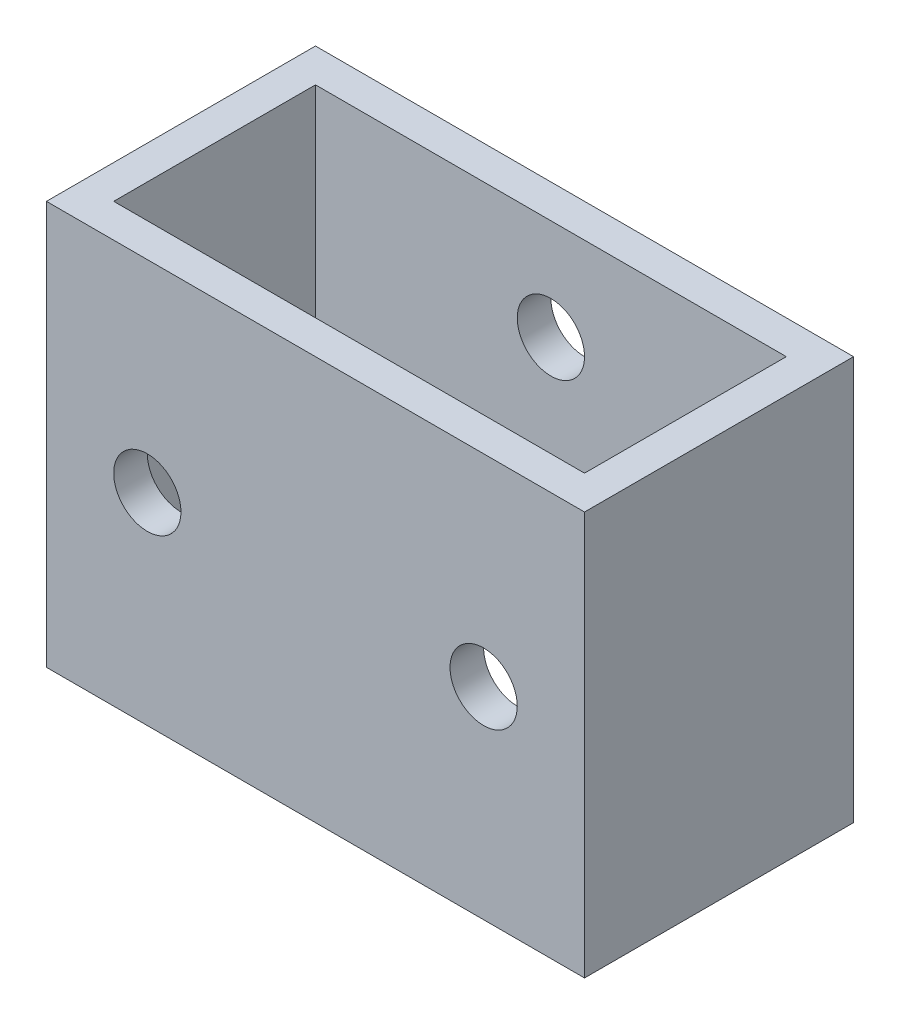
ISO-10303-21;
HEADER;
FILE_DESCRIPTION(('STEP AP214'),'2;1');
FILE_NAME('part.step','',(''),(''),'','','');
FILE_SCHEMA(('AUTOMOTIVE_DESIGN { 1 0 10303 214 1 1 1 1 }'));
ENDSEC;
DATA;
#1=APPLICATION_CONTEXT('core data for automotive mechanical design processes');
#2=APPLICATION_PROTOCOL_DEFINITION('international standard','automotive_design',2000,#1);
#3=PRODUCT_CONTEXT('',#1,'mechanical');
#4=PRODUCT('Part','Part','',(#3));
#5=PRODUCT_RELATED_PRODUCT_CATEGORY('part','',(#4));
#6=PRODUCT_DEFINITION_FORMATION('','',#4);
#7=PRODUCT_DEFINITION_CONTEXT('part definition',#1,'design');
#8=PRODUCT_DEFINITION('design','',#6,#7);
#9=PRODUCT_DEFINITION_SHAPE('','',#8);
#10=(LENGTH_UNIT() NAMED_UNIT(*) SI_UNIT(.MILLI.,.METRE.));
#11=(NAMED_UNIT(*) PLANE_ANGLE_UNIT() SI_UNIT($,.RADIAN.));
#12=(NAMED_UNIT(*) SI_UNIT($,.STERADIAN.) SOLID_ANGLE_UNIT());
#13=UNCERTAINTY_MEASURE_WITH_UNIT(LENGTH_MEASURE(1.E-05),#10,'distance_accuracy_value','');
#14=(GEOMETRIC_REPRESENTATION_CONTEXT(3) GLOBAL_UNCERTAINTY_ASSIGNED_CONTEXT((#13)) GLOBAL_UNIT_ASSIGNED_CONTEXT((#10,
#11,#12)) REPRESENTATION_CONTEXT('',''));
#15=CARTESIAN_POINT('',(0.,0.,0.));
#16=DIRECTION('',(0.,0.,1.));
#17=DIRECTION('',(1.,0.,0.));
#18=AXIS2_PLACEMENT_3D('',#15,#16,#17);
#19=CARTESIAN_POINT('',(0.,38.1,0.));
#20=DIRECTION('',(0.,1.,0.));
#21=DIRECTION('',(0.,0.,1.));
#22=AXIS2_PLACEMENT_3D('',#19,#20,#21);
#23=PLANE('',#22);
#24=DIRECTION('',(0.,0.,-1.));
#25=VECTOR('',#24,1.);
#26=CARTESIAN_POINT('',(25.4,38.1,-12.7));
#27=LINE('',#26,#25);
#28=CARTESIAN_POINT('',(25.4,38.1,12.7));
#29=VERTEX_POINT('',#28);
#30=CARTESIAN_POINT('',(25.4,38.1,-12.7));
#31=VERTEX_POINT('',#30);
#32=EDGE_CURVE('E136',#29,#31,#27,.T.);
#33=ORIENTED_EDGE('',*,*,#32,.T.);
#34=DIRECTION('',(-1.,0.,0.));
#35=VECTOR('',#34,1.);
#36=CARTESIAN_POINT('',(-25.4,38.1,-12.7));
#37=LINE('',#36,#35);
#38=CARTESIAN_POINT('',(-25.4,38.1,-12.7));
#39=VERTEX_POINT('',#38);
#40=EDGE_CURVE('E139',#31,#39,#37,.T.);
#41=ORIENTED_EDGE('',*,*,#40,.T.);
#42=DIRECTION('',(0.,0.,1.));
#43=VECTOR('',#42,1.);
#44=CARTESIAN_POINT('',(-25.4,38.1,-12.7));
#45=LINE('',#44,#43);
#46=CARTESIAN_POINT('',(-25.4,38.1,12.7));
#47=VERTEX_POINT('',#46);
#48=EDGE_CURVE('E142',#39,#47,#45,.T.);
#49=ORIENTED_EDGE('',*,*,#48,.T.);
#50=DIRECTION('',(1.,0.,0.));
#51=VECTOR('',#50,1.);
#52=CARTESIAN_POINT('',(-25.4,38.1,12.7));
#53=LINE('',#52,#51);
#54=EDGE_CURVE('E144',#47,#29,#53,.T.);
#55=ORIENTED_EDGE('',*,*,#54,.T.);
#56=EDGE_LOOP('',(#33,#41,#49,#55));
#57=FACE_BOUND('',#56,.T.);
#58=DIRECTION('',(1.,0.,0.));
#59=VECTOR('',#58,1.);
#60=CARTESIAN_POINT('',(22.225,38.1,9.52499999999999));
#61=LINE('',#60,#59);
#62=CARTESIAN_POINT('',(-22.225,38.1,9.525));
#63=VERTEX_POINT('',#62);
#64=CARTESIAN_POINT('',(22.225,38.1,9.52499999999999));
#65=VERTEX_POINT('',#64);
#66=EDGE_CURVE('E106',#63,#65,#61,.T.);
#67=ORIENTED_EDGE('',*,*,#66,.F.);
#68=DIRECTION('',(0.,0.,1.));
#69=VECTOR('',#68,1.);
#70=CARTESIAN_POINT('',(-22.225,38.1,-9.525));
#71=LINE('',#70,#69);
#72=CARTESIAN_POINT('',(-22.225,38.1,-9.525));
#73=VERTEX_POINT('',#72);
#74=EDGE_CURVE('E98',#73,#63,#71,.T.);
#75=ORIENTED_EDGE('',*,*,#74,.F.);
#76=DIRECTION('',(-1.,0.,0.));
#77=VECTOR('',#76,1.);
#78=CARTESIAN_POINT('',(22.225,38.1,-9.52500000000001));
#79=LINE('',#78,#77);
#80=CARTESIAN_POINT('',(22.225,38.1,-9.52500000000001));
#81=VERTEX_POINT('',#80);
#82=EDGE_CURVE('E120',#81,#73,#79,.T.);
#83=ORIENTED_EDGE('',*,*,#82,.F.);
#84=DIRECTION('',(0.,0.,-1.));
#85=VECTOR('',#84,1.);
#86=CARTESIAN_POINT('',(22.225,38.1,-9.52500000000001));
#87=LINE('',#86,#85);
#88=EDGE_CURVE('E118',#65,#81,#87,.T.);
#89=ORIENTED_EDGE('',*,*,#88,.F.);
#90=EDGE_LOOP('',(#67,#75,#83,#89));
#91=FACE_BOUND('',#90,.T.);
#92=ADVANCED_FACE('F33',(#57,#91),#23,.T.);
#93=CARTESIAN_POINT('',(0.,0.,0.));
#94=DIRECTION('',(0.,1.,0.));
#95=DIRECTION('',(0.,0.,1.));
#96=AXIS2_PLACEMENT_3D('',#93,#94,#95);
#97=PLANE('',#96);
#98=DIRECTION('',(0.,0.,-1.));
#99=VECTOR('',#98,1.);
#100=CARTESIAN_POINT('',(25.4,0.,-12.7));
#101=LINE('',#100,#99);
#102=CARTESIAN_POINT('',(25.4,0.,12.7));
#103=VERTEX_POINT('',#102);
#104=CARTESIAN_POINT('',(25.4,0.,-12.7));
#105=VERTEX_POINT('',#104);
#106=EDGE_CURVE('E114',#103,#105,#101,.T.);
#107=ORIENTED_EDGE('',*,*,#106,.F.);
#108=DIRECTION('',(1.,0.,0.));
#109=VECTOR('',#108,1.);
#110=CARTESIAN_POINT('',(-25.4,0.,12.7));
#111=LINE('',#110,#109);
#112=CARTESIAN_POINT('',(-25.4,0.,12.7));
#113=VERTEX_POINT('',#112);
#114=EDGE_CURVE('E140',#113,#103,#111,.T.);
#115=ORIENTED_EDGE('',*,*,#114,.F.);
#116=DIRECTION('',(0.,0.,1.));
#117=VECTOR('',#116,1.);
#118=CARTESIAN_POINT('',(-25.4,0.,-12.7));
#119=LINE('',#118,#117);
#120=CARTESIAN_POINT('',(-25.4,0.,-12.7));
#121=VERTEX_POINT('',#120);
#122=EDGE_CURVE('E151',#121,#113,#119,.T.);
#123=ORIENTED_EDGE('',*,*,#122,.F.);
#124=DIRECTION('',(-1.,0.,0.));
#125=VECTOR('',#124,1.);
#126=CARTESIAN_POINT('',(-25.4,0.,-12.7));
#127=LINE('',#126,#125);
#128=EDGE_CURVE('E149',#105,#121,#127,.T.);
#129=ORIENTED_EDGE('',*,*,#128,.F.);
#130=EDGE_LOOP('',(#107,#115,#123,#129));
#131=FACE_BOUND('',#130,.T.);
#132=DIRECTION('',(0.,0.,1.));
#133=VECTOR('',#132,1.);
#134=CARTESIAN_POINT('',(-22.225,0.,-9.525));
#135=LINE('',#134,#133);
#136=CARTESIAN_POINT('',(-22.225,0.,-9.525));
#137=VERTEX_POINT('',#136);
#138=CARTESIAN_POINT('',(-22.225,0.,9.525));
#139=VERTEX_POINT('',#138);
#140=EDGE_CURVE('E56',#137,#139,#135,.T.);
#141=ORIENTED_EDGE('',*,*,#140,.T.);
#142=DIRECTION('',(1.,0.,0.));
#143=VECTOR('',#142,1.);
#144=CARTESIAN_POINT('',(22.225,0.,9.52499999999999));
#145=LINE('',#144,#143);
#146=CARTESIAN_POINT('',(22.225,0.,9.52499999999999));
#147=VERTEX_POINT('',#146);
#148=EDGE_CURVE('E113',#139,#147,#145,.T.);
#149=ORIENTED_EDGE('',*,*,#148,.T.);
#150=DIRECTION('',(0.,0.,-1.));
#151=VECTOR('',#150,1.);
#152=CARTESIAN_POINT('',(22.225,0.,-9.52500000000001));
#153=LINE('',#152,#151);
#154=CARTESIAN_POINT('',(22.225,0.,-9.52500000000001));
#155=VERTEX_POINT('',#154);
#156=EDGE_CURVE('E128',#147,#155,#153,.T.);
#157=ORIENTED_EDGE('',*,*,#156,.T.);
#158=DIRECTION('',(-1.,0.,0.));
#159=VECTOR('',#158,1.);
#160=CARTESIAN_POINT('',(22.225,0.,-9.52500000000001));
#161=LINE('',#160,#159);
#162=EDGE_CURVE('E107',#155,#137,#161,.T.);
#163=ORIENTED_EDGE('',*,*,#162,.T.);
#164=EDGE_LOOP('',(#141,#149,#157,#163));
#165=FACE_BOUND('',#164,.T.);
#166=ADVANCED_FACE('F169',(#131,#165),#97,.F.);
#167=CARTESIAN_POINT('',(25.4,38.1,-12.7));
#168=DIRECTION('',(-1.,0.,0.));
#169=DIRECTION('',(0.,0.,1.));
#170=AXIS2_PLACEMENT_3D('',#167,#168,#169);
#171=PLANE('',#170);
#172=ORIENTED_EDGE('',*,*,#106,.T.);
#173=DIRECTION('',(0.,-1.,0.));
#174=VECTOR('',#173,1.);
#175=CARTESIAN_POINT('',(25.4,38.1,-12.7));
#176=LINE('',#175,#174);
#177=EDGE_CURVE('E11',#31,#105,#176,.T.);
#178=ORIENTED_EDGE('',*,*,#177,.F.);
#179=ORIENTED_EDGE('',*,*,#32,.F.);
#180=DIRECTION('',(0.,-1.,0.));
#181=VECTOR('',#180,1.);
#182=CARTESIAN_POINT('',(25.4,38.1,12.7));
#183=LINE('',#182,#181);
#184=EDGE_CURVE('E146',#29,#103,#183,.T.);
#185=ORIENTED_EDGE('',*,*,#184,.T.);
#186=EDGE_LOOP('',(#172,#178,#179,#185));
#187=FACE_BOUND('',#186,.T.);
#188=ADVANCED_FACE('F35',(#187),#171,.F.);
#189=CARTESIAN_POINT('',(-25.4,38.1,-12.7));
#190=DIRECTION('',(0.,0.,1.));
#191=DIRECTION('',(1.,0.,0.));
#192=AXIS2_PLACEMENT_3D('',#189,#190,#191);
#193=PLANE('',#192);
#194=CARTESIAN_POINT('',(0.,9.525,-12.7));
#195=DIRECTION('',(0.,0.,-1.));
#196=DIRECTION('',(-1.,0.,0.));
#197=AXIS2_PLACEMENT_3D('',#194,#195,#196);
#198=CIRCLE('',#197,3.175);
#199=CARTESIAN_POINT('',(-3.175,9.525,-12.7));
#200=VERTEX_POINT('',#199);
#201=EDGE_CURVE('E215',#200,#200,#198,.T.);
#202=ORIENTED_EDGE('',*,*,#201,.F.);
#203=EDGE_LOOP('',(#202));
#204=FACE_BOUND('',#203,.T.);
#205=CARTESIAN_POINT('',(0.,28.575,-12.7));
#206=DIRECTION('',(0.,0.,-1.));
#207=DIRECTION('',(-1.,0.,0.));
#208=AXIS2_PLACEMENT_3D('',#205,#206,#207);
#209=CIRCLE('',#208,3.175);
#210=CARTESIAN_POINT('',(-3.175,28.575,-12.7));
#211=VERTEX_POINT('',#210);
#212=EDGE_CURVE('E126',#211,#211,#209,.T.);
#213=ORIENTED_EDGE('',*,*,#212,.F.);
#214=EDGE_LOOP('',(#213));
#215=FACE_BOUND('',#214,.T.);
#216=ORIENTED_EDGE('',*,*,#128,.T.);
#217=DIRECTION('',(0.,-1.,0.));
#218=VECTOR('',#217,1.);
#219=CARTESIAN_POINT('',(-25.4,38.1,-12.7));
#220=LINE('',#219,#218);
#221=EDGE_CURVE('E41',#39,#121,#220,.T.);
#222=ORIENTED_EDGE('',*,*,#221,.F.);
#223=ORIENTED_EDGE('',*,*,#40,.F.);
#224=ORIENTED_EDGE('',*,*,#177,.T.);
#225=EDGE_LOOP('',(#216,#222,#223,#224));
#226=FACE_BOUND('',#225,.T.);
#227=ADVANCED_FACE('F179',(#204,#215,#226),#193,.F.);
#228=CARTESIAN_POINT('',(-25.4,38.1,-12.7));
#229=DIRECTION('',(1.,0.,0.));
#230=DIRECTION('',(0.,0.,-1.));
#231=AXIS2_PLACEMENT_3D('',#228,#229,#230);
#232=PLANE('',#231);
#233=ORIENTED_EDGE('',*,*,#122,.T.);
#234=DIRECTION('',(0.,-1.,0.));
#235=VECTOR('',#234,1.);
#236=CARTESIAN_POINT('',(-25.4,38.1,12.7));
#237=LINE('',#236,#235);
#238=EDGE_CURVE('E156',#47,#113,#237,.T.);
#239=ORIENTED_EDGE('',*,*,#238,.F.);
#240=ORIENTED_EDGE('',*,*,#48,.F.);
#241=ORIENTED_EDGE('',*,*,#221,.T.);
#242=EDGE_LOOP('',(#233,#239,#240,#241));
#243=FACE_BOUND('',#242,.T.);
#244=ADVANCED_FACE('F163',(#243),#232,.F.);
#245=CARTESIAN_POINT('',(-25.4,38.1,12.7));
#246=DIRECTION('',(0.,0.,-1.));
#247=DIRECTION('',(-1.,0.,0.));
#248=AXIS2_PLACEMENT_3D('',#245,#246,#247);
#249=PLANE('',#248);
#250=CARTESIAN_POINT('',(-15.875,19.05,12.7));
#251=DIRECTION('',(0.,0.,1.));
#252=DIRECTION('',(1.,0.,0.));
#253=AXIS2_PLACEMENT_3D('',#250,#251,#252);
#254=CIRCLE('',#253,3.175);
#255=CARTESIAN_POINT('',(-12.7,19.05,12.7));
#256=VERTEX_POINT('',#255);
#257=EDGE_CURVE('E206',#256,#256,#254,.T.);
#258=ORIENTED_EDGE('',*,*,#257,.F.);
#259=EDGE_LOOP('',(#258));
#260=FACE_BOUND('',#259,.T.);
#261=CARTESIAN_POINT('',(15.875,19.05,12.7));
#262=DIRECTION('',(0.,0.,1.));
#263=DIRECTION('',(1.,0.,0.));
#264=AXIS2_PLACEMENT_3D('',#261,#262,#263);
#265=CIRCLE('',#264,3.175);
#266=CARTESIAN_POINT('',(19.05,19.05,12.7));
#267=VERTEX_POINT('',#266);
#268=EDGE_CURVE('E209',#267,#267,#265,.T.);
#269=ORIENTED_EDGE('',*,*,#268,.F.);
#270=EDGE_LOOP('',(#269));
#271=FACE_BOUND('',#270,.T.);
#272=ORIENTED_EDGE('',*,*,#114,.T.);
#273=ORIENTED_EDGE('',*,*,#184,.F.);
#274=ORIENTED_EDGE('',*,*,#54,.F.);
#275=ORIENTED_EDGE('',*,*,#238,.T.);
#276=EDGE_LOOP('',(#272,#273,#274,#275));
#277=FACE_BOUND('',#276,.T.);
#278=ADVANCED_FACE('F173',(#260,#271,#277),#249,.F.);
#279=CARTESIAN_POINT('',(-22.225,38.1,-9.525));
#280=DIRECTION('',(1.,0.,0.));
#281=DIRECTION('',(0.,0.,-1.));
#282=AXIS2_PLACEMENT_3D('',#279,#280,#281);
#283=PLANE('',#282);
#284=ORIENTED_EDGE('',*,*,#140,.F.);
#285=DIRECTION('',(0.,-1.,0.));
#286=VECTOR('',#285,1.);
#287=CARTESIAN_POINT('',(-22.225,38.1,-9.525));
#288=LINE('',#287,#286);
#289=EDGE_CURVE('E102',#73,#137,#288,.T.);
#290=ORIENTED_EDGE('',*,*,#289,.F.);
#291=ORIENTED_EDGE('',*,*,#74,.T.);
#292=DIRECTION('',(0.,-1.,0.));
#293=VECTOR('',#292,1.);
#294=CARTESIAN_POINT('',(-22.225,38.1,9.525));
#295=LINE('',#294,#293);
#296=EDGE_CURVE('E101',#63,#139,#295,.T.);
#297=ORIENTED_EDGE('',*,*,#296,.T.);
#298=EDGE_LOOP('',(#284,#290,#291,#297));
#299=FACE_BOUND('',#298,.T.);
#300=ADVANCED_FACE('F100',(#299),#283,.T.);
#301=CARTESIAN_POINT('',(22.225,38.1,9.52499999999999));
#302=DIRECTION('',(0.,0.,-1.));
#303=DIRECTION('',(-1.,0.,0.));
#304=AXIS2_PLACEMENT_3D('',#301,#302,#303);
#305=PLANE('',#304);
#306=CARTESIAN_POINT('',(-15.875,19.05,9.525));
#307=DIRECTION('',(0.,0.,-1.));
#308=DIRECTION('',(-1.,0.,0.));
#309=AXIS2_PLACEMENT_3D('',#306,#307,#308);
#310=CIRCLE('',#309,3.175);
#311=CARTESIAN_POINT('',(-12.7,19.05,9.525));
#312=VERTEX_POINT('',#311);
#313=EDGE_CURVE('E257',#312,#312,#310,.F.);
#314=ORIENTED_EDGE('',*,*,#313,.T.);
#315=EDGE_LOOP('',(#314));
#316=FACE_BOUND('',#315,.T.);
#317=CARTESIAN_POINT('',(15.875,19.05,9.52499999999999));
#318=DIRECTION('',(0.,0.,-1.));
#319=DIRECTION('',(-1.,0.,0.));
#320=AXIS2_PLACEMENT_3D('',#317,#318,#319);
#321=CIRCLE('',#320,3.175);
#322=CARTESIAN_POINT('',(19.05,19.05,9.52499999999999));
#323=VERTEX_POINT('',#322);
#324=EDGE_CURVE('E212',#323,#323,#321,.F.);
#325=ORIENTED_EDGE('',*,*,#324,.T.);
#326=EDGE_LOOP('',(#325));
#327=FACE_BOUND('',#326,.T.);
#328=ORIENTED_EDGE('',*,*,#148,.F.);
#329=ORIENTED_EDGE('',*,*,#296,.F.);
#330=ORIENTED_EDGE('',*,*,#66,.T.);
#331=DIRECTION('',(0.,-1.,0.));
#332=VECTOR('',#331,1.);
#333=CARTESIAN_POINT('',(22.225,38.1,9.52499999999999));
#334=LINE('',#333,#332);
#335=EDGE_CURVE('E115',#65,#147,#334,.T.);
#336=ORIENTED_EDGE('',*,*,#335,.T.);
#337=EDGE_LOOP('',(#328,#329,#330,#336));
#338=FACE_BOUND('',#337,.T.);
#339=ADVANCED_FACE('F110',(#316,#327,#338),#305,.T.);
#340=CARTESIAN_POINT('',(22.225,38.1,-9.52500000000001));
#341=DIRECTION('',(-1.,0.,0.));
#342=DIRECTION('',(0.,0.,1.));
#343=AXIS2_PLACEMENT_3D('',#340,#341,#342);
#344=PLANE('',#343);
#345=ORIENTED_EDGE('',*,*,#156,.F.);
#346=ORIENTED_EDGE('',*,*,#335,.F.);
#347=ORIENTED_EDGE('',*,*,#88,.T.);
#348=DIRECTION('',(0.,-1.,0.));
#349=VECTOR('',#348,1.);
#350=CARTESIAN_POINT('',(22.225,38.1,-9.52500000000001));
#351=LINE('',#350,#349);
#352=EDGE_CURVE('E48',#81,#155,#351,.T.);
#353=ORIENTED_EDGE('',*,*,#352,.T.);
#354=EDGE_LOOP('',(#345,#346,#347,#353));
#355=FACE_BOUND('',#354,.T.);
#356=ADVANCED_FACE('F243',(#355),#344,.T.);
#357=CARTESIAN_POINT('',(22.225,38.1,-9.52500000000001));
#358=DIRECTION('',(0.,0.,1.));
#359=DIRECTION('',(1.,0.,0.));
#360=AXIS2_PLACEMENT_3D('',#357,#358,#359);
#361=PLANE('',#360);
#362=CARTESIAN_POINT('',(0.,9.525,-9.525));
#363=DIRECTION('',(0.,0.,1.));
#364=DIRECTION('',(1.,0.,0.));
#365=AXIS2_PLACEMENT_3D('',#362,#363,#364);
#366=CIRCLE('',#365,3.175);
#367=CARTESIAN_POINT('',(-3.175,9.525,-9.525));
#368=VERTEX_POINT('',#367);
#369=EDGE_CURVE('E211',#368,#368,#366,.F.);
#370=ORIENTED_EDGE('',*,*,#369,.T.);
#371=EDGE_LOOP('',(#370));
#372=FACE_BOUND('',#371,.T.);
#373=CARTESIAN_POINT('',(0.,28.575,-9.525));
#374=DIRECTION('',(0.,0.,1.));
#375=DIRECTION('',(1.,0.,0.));
#376=AXIS2_PLACEMENT_3D('',#373,#374,#375);
#377=CIRCLE('',#376,3.175);
#378=CARTESIAN_POINT('',(-3.175,28.575,-9.525));
#379=VERTEX_POINT('',#378);
#380=EDGE_CURVE('E222',#379,#379,#377,.F.);
#381=ORIENTED_EDGE('',*,*,#380,.T.);
#382=EDGE_LOOP('',(#381));
#383=FACE_BOUND('',#382,.T.);
#384=ORIENTED_EDGE('',*,*,#162,.F.);
#385=ORIENTED_EDGE('',*,*,#352,.F.);
#386=ORIENTED_EDGE('',*,*,#82,.T.);
#387=ORIENTED_EDGE('',*,*,#289,.T.);
#388=EDGE_LOOP('',(#384,#385,#386,#387));
#389=FACE_BOUND('',#388,.T.);
#390=ADVANCED_FACE('F228',(#372,#383,#389),#361,.T.);
#391=CARTESIAN_POINT('',(0.,28.575,12.701));
#392=DIRECTION('',(0.,0.,-1.));
#393=DIRECTION('',(-1.,0.,0.));
#394=AXIS2_PLACEMENT_3D('',#391,#392,#393);
#395=CYLINDRICAL_SURFACE('',#394,3.175);
#396=CARTESIAN_POINT('',(-3.175,28.575,-9.525));
#397=CARTESIAN_POINT('',(-3.175,28.575,-9.55807291666666));
#398=CARTESIAN_POINT('',(-3.175,28.575,-9.59114583333333));
#399=CARTESIAN_POINT('',(-3.175,28.575,-9.65729166666666));
#400=CARTESIAN_POINT('',(-3.175,28.575,-9.69036458333333));
#401=CARTESIAN_POINT('',(-3.175,28.575,-9.75651041666666));
#402=CARTESIAN_POINT('',(-3.175,28.575,-9.78958333333333));
#403=CARTESIAN_POINT('',(-3.175,28.575,-9.85572916666666));
#404=CARTESIAN_POINT('',(-3.175,28.575,-9.88880208333333));
#405=CARTESIAN_POINT('',(-3.175,28.575,-9.95494791666666));
#406=CARTESIAN_POINT('',(-3.175,28.575,-9.98802083333333));
#407=CARTESIAN_POINT('',(-3.175,28.575,-10.0541666666667));
#408=CARTESIAN_POINT('',(-3.175,28.575,-10.0872395833333));
#409=CARTESIAN_POINT('',(-3.175,28.575,-10.1533854166667));
#410=CARTESIAN_POINT('',(-3.175,28.575,-10.1864583333333));
#411=CARTESIAN_POINT('',(-3.175,28.575,-10.2526041666667));
#412=CARTESIAN_POINT('',(-3.175,28.575,-10.2856770833333));
#413=CARTESIAN_POINT('',(-3.175,28.575,-10.3518229166667));
#414=CARTESIAN_POINT('',(-3.175,28.575,-10.3848958333333));
#415=CARTESIAN_POINT('',(-3.175,28.575,-10.4510416666667));
#416=CARTESIAN_POINT('',(-3.175,28.575,-10.4841145833333));
#417=CARTESIAN_POINT('',(-3.175,28.575,-10.5502604166667));
#418=CARTESIAN_POINT('',(-3.175,28.575,-10.5833333333333));
#419=CARTESIAN_POINT('',(-3.175,28.575,-10.6494791666667));
#420=CARTESIAN_POINT('',(-3.175,28.575,-10.6825520833333));
#421=CARTESIAN_POINT('',(-3.175,28.575,-10.7486979166667));
#422=CARTESIAN_POINT('',(-3.175,28.575,-10.7817708333333));
#423=CARTESIAN_POINT('',(-3.175,28.575,-10.8479166666667));
#424=CARTESIAN_POINT('',(-3.175,28.575,-10.8809895833333));
#425=CARTESIAN_POINT('',(-3.175,28.575,-10.9471354166667));
#426=CARTESIAN_POINT('',(-3.175,28.575,-10.9802083333333));
#427=CARTESIAN_POINT('',(-3.175,28.575,-11.0463541666667));
#428=CARTESIAN_POINT('',(-3.175,28.575,-11.0794270833333));
#429=CARTESIAN_POINT('',(-3.175,28.575,-11.1455729166667));
#430=CARTESIAN_POINT('',(-3.175,28.575,-11.1786458333333));
#431=CARTESIAN_POINT('',(-3.175,28.575,-11.2447916666667));
#432=CARTESIAN_POINT('',(-3.175,28.575,-11.2778645833333));
#433=CARTESIAN_POINT('',(-3.175,28.575,-11.3440104166667));
#434=CARTESIAN_POINT('',(-3.175,28.575,-11.3770833333333));
#435=CARTESIAN_POINT('',(-3.175,28.575,-11.4432291666667));
#436=CARTESIAN_POINT('',(-3.175,28.575,-11.4763020833333));
#437=CARTESIAN_POINT('',(-3.175,28.575,-11.5424479166667));
#438=CARTESIAN_POINT('',(-3.175,28.575,-11.5755208333333));
#439=CARTESIAN_POINT('',(-3.175,28.575,-11.6416666666667));
#440=CARTESIAN_POINT('',(-3.175,28.575,-11.6747395833333));
#441=CARTESIAN_POINT('',(-3.175,28.575,-11.7408854166667));
#442=CARTESIAN_POINT('',(-3.175,28.575,-11.7739583333333));
#443=CARTESIAN_POINT('',(-3.175,28.575,-11.8401041666667));
#444=CARTESIAN_POINT('',(-3.175,28.575,-11.8731770833333));
#445=CARTESIAN_POINT('',(-3.175,28.575,-11.9393229166667));
#446=CARTESIAN_POINT('',(-3.175,28.575,-11.9723958333333));
#447=CARTESIAN_POINT('',(-3.175,28.575,-12.0385416666667));
#448=CARTESIAN_POINT('',(-3.175,28.575,-12.0716145833333));
#449=CARTESIAN_POINT('',(-3.175,28.575,-12.1377604166667));
#450=CARTESIAN_POINT('',(-3.175,28.575,-12.1708333333333));
#451=CARTESIAN_POINT('',(-3.175,28.575,-12.2369791666667));
#452=CARTESIAN_POINT('',(-3.175,28.575,-12.2700520833333));
#453=CARTESIAN_POINT('',(-3.175,28.575,-12.3361979166667));
#454=CARTESIAN_POINT('',(-3.175,28.575,-12.3692708333333));
#455=CARTESIAN_POINT('',(-3.175,28.575,-12.4354166666667));
#456=CARTESIAN_POINT('',(-3.175,28.575,-12.4684895833333));
#457=CARTESIAN_POINT('',(-3.175,28.575,-12.5346354166667));
#458=CARTESIAN_POINT('',(-3.175,28.575,-12.5677083333333));
#459=CARTESIAN_POINT('',(-3.175,28.575,-12.6338541666667));
#460=CARTESIAN_POINT('',(-3.175,28.575,-12.6669270833333));
#461=CARTESIAN_POINT('',(-3.175,28.575,-12.7));
#462=B_SPLINE_CURVE_WITH_KNOTS('',3,(#396,#397,#398,#399,#400,#401,#402,#403,#404,#405,#406,
#407,#408,#409,#410,#411,#412,#413,#414,#415,#416,#417,#418,#419,#420,#421,#422,#423,#424,#425,
#426,#427,#428,#429,#430,#431,#432,#433,#434,#435,#436,#437,#438,#439,#440,#441,#442,#443,#444,
#445,#446,#447,#448,#449,#450,#451,#452,#453,#454,#455,#456,#457,#458,#459,#460,#461),
.UNSPECIFIED.,.F.,.F.,(4,2,2,2,2,2,2,2,2,2,2,2,2,2,2,2,2,2,2,2,2,2,2,2,2,2,2,2,2,2,2,2,4),(0.,
0.0992187500000012,0.198437499999999,0.29765625,0.396875000000001,0.496093749999999,0.5953125,
0.694531250000002,0.793750000000003,0.892968750000001,0.992187500000002,1.09140625,1.190625,
1.28984375,1.3890625,1.48828125,1.5875,1.68671875,1.7859375,1.88515625,1.984375,2.08359375,
2.1828125,2.28203125,2.38125,2.48046875,2.5796875,2.67890625,2.778125,2.87734375,
2.97656250000001,3.07578125,3.175),.UNSPECIFIED.);
#463=EDGE_CURVE('BSEAM230',#379,#211,#462,.T.);
#464=ORIENTED_EDGE('',*,*,#380,.F.);
#465=ORIENTED_EDGE('',*,*,#212,.T.);
#466=ORIENTED_EDGE('',*,*,#463,.T.);
#467=ORIENTED_EDGE('',*,*,#463,.F.);
#468=EDGE_LOOP('',(#464,#466,#465,#467));
#469=FACE_BOUND('',#468,.T.);
#470=ADVANCED_FACE('F230',(#469),#395,.F.);
#471=CARTESIAN_POINT('',(0.,9.525,12.701));
#472=DIRECTION('',(0.,0.,-1.));
#473=DIRECTION('',(-1.,0.,0.));
#474=AXIS2_PLACEMENT_3D('',#471,#472,#473);
#475=CYLINDRICAL_SURFACE('',#474,3.175);
#476=CARTESIAN_POINT('',(-3.175,9.525,-9.525));
#477=CARTESIAN_POINT('',(-3.175,9.525,-9.55807291666666));
#478=CARTESIAN_POINT('',(-3.175,9.525,-9.59114583333333));
#479=CARTESIAN_POINT('',(-3.175,9.525,-9.65729166666666));
#480=CARTESIAN_POINT('',(-3.175,9.525,-9.69036458333333));
#481=CARTESIAN_POINT('',(-3.175,9.525,-9.75651041666666));
#482=CARTESIAN_POINT('',(-3.175,9.525,-9.78958333333333));
#483=CARTESIAN_POINT('',(-3.175,9.525,-9.85572916666666));
#484=CARTESIAN_POINT('',(-3.175,9.525,-9.88880208333333));
#485=CARTESIAN_POINT('',(-3.175,9.525,-9.95494791666666));
#486=CARTESIAN_POINT('',(-3.175,9.525,-9.98802083333333));
#487=CARTESIAN_POINT('',(-3.175,9.525,-10.0541666666667));
#488=CARTESIAN_POINT('',(-3.175,9.525,-10.0872395833333));
#489=CARTESIAN_POINT('',(-3.175,9.525,-10.1533854166667));
#490=CARTESIAN_POINT('',(-3.175,9.525,-10.1864583333333));
#491=CARTESIAN_POINT('',(-3.175,9.525,-10.2526041666667));
#492=CARTESIAN_POINT('',(-3.175,9.525,-10.2856770833333));
#493=CARTESIAN_POINT('',(-3.175,9.525,-10.3518229166667));
#494=CARTESIAN_POINT('',(-3.175,9.525,-10.3848958333333));
#495=CARTESIAN_POINT('',(-3.175,9.525,-10.4510416666667));
#496=CARTESIAN_POINT('',(-3.175,9.525,-10.4841145833333));
#497=CARTESIAN_POINT('',(-3.175,9.525,-10.5502604166667));
#498=CARTESIAN_POINT('',(-3.175,9.525,-10.5833333333333));
#499=CARTESIAN_POINT('',(-3.175,9.525,-10.6494791666667));
#500=CARTESIAN_POINT('',(-3.175,9.525,-10.6825520833333));
#501=CARTESIAN_POINT('',(-3.175,9.525,-10.7486979166667));
#502=CARTESIAN_POINT('',(-3.175,9.525,-10.7817708333333));
#503=CARTESIAN_POINT('',(-3.175,9.525,-10.8479166666667));
#504=CARTESIAN_POINT('',(-3.175,9.525,-10.8809895833333));
#505=CARTESIAN_POINT('',(-3.175,9.525,-10.9471354166667));
#506=CARTESIAN_POINT('',(-3.175,9.525,-10.9802083333333));
#507=CARTESIAN_POINT('',(-3.175,9.525,-11.0463541666667));
#508=CARTESIAN_POINT('',(-3.175,9.525,-11.0794270833333));
#509=CARTESIAN_POINT('',(-3.175,9.525,-11.1455729166667));
#510=CARTESIAN_POINT('',(-3.175,9.525,-11.1786458333333));
#511=CARTESIAN_POINT('',(-3.175,9.525,-11.2447916666667));
#512=CARTESIAN_POINT('',(-3.175,9.525,-11.2778645833333));
#513=CARTESIAN_POINT('',(-3.175,9.525,-11.3440104166667));
#514=CARTESIAN_POINT('',(-3.175,9.525,-11.3770833333333));
#515=CARTESIAN_POINT('',(-3.175,9.525,-11.4432291666667));
#516=CARTESIAN_POINT('',(-3.175,9.525,-11.4763020833333));
#517=CARTESIAN_POINT('',(-3.175,9.525,-11.5424479166667));
#518=CARTESIAN_POINT('',(-3.175,9.525,-11.5755208333333));
#519=CARTESIAN_POINT('',(-3.175,9.525,-11.6416666666667));
#520=CARTESIAN_POINT('',(-3.175,9.525,-11.6747395833333));
#521=CARTESIAN_POINT('',(-3.175,9.525,-11.7408854166667));
#522=CARTESIAN_POINT('',(-3.175,9.525,-11.7739583333333));
#523=CARTESIAN_POINT('',(-3.175,9.525,-11.8401041666667));
#524=CARTESIAN_POINT('',(-3.175,9.525,-11.8731770833333));
#525=CARTESIAN_POINT('',(-3.175,9.525,-11.9393229166667));
#526=CARTESIAN_POINT('',(-3.175,9.525,-11.9723958333333));
#527=CARTESIAN_POINT('',(-3.175,9.525,-12.0385416666667));
#528=CARTESIAN_POINT('',(-3.175,9.525,-12.0716145833333));
#529=CARTESIAN_POINT('',(-3.175,9.525,-12.1377604166667));
#530=CARTESIAN_POINT('',(-3.175,9.525,-12.1708333333333));
#531=CARTESIAN_POINT('',(-3.175,9.525,-12.2369791666667));
#532=CARTESIAN_POINT('',(-3.175,9.525,-12.2700520833333));
#533=CARTESIAN_POINT('',(-3.175,9.525,-12.3361979166667));
#534=CARTESIAN_POINT('',(-3.175,9.525,-12.3692708333333));
#535=CARTESIAN_POINT('',(-3.175,9.525,-12.4354166666667));
#536=CARTESIAN_POINT('',(-3.175,9.525,-12.4684895833333));
#537=CARTESIAN_POINT('',(-3.175,9.525,-12.5346354166667));
#538=CARTESIAN_POINT('',(-3.175,9.525,-12.5677083333333));
#539=CARTESIAN_POINT('',(-3.175,9.525,-12.6338541666667));
#540=CARTESIAN_POINT('',(-3.175,9.525,-12.6669270833333));
#541=CARTESIAN_POINT('',(-3.175,9.525,-12.7));
#542=B_SPLINE_CURVE_WITH_KNOTS('',3,(#476,#477,#478,#479,#480,#481,#482,#483,#484,#485,#486,
#487,#488,#489,#490,#491,#492,#493,#494,#495,#496,#497,#498,#499,#500,#501,#502,#503,#504,#505,
#506,#507,#508,#509,#510,#511,#512,#513,#514,#515,#516,#517,#518,#519,#520,#521,#522,#523,#524,
#525,#526,#527,#528,#529,#530,#531,#532,#533,#534,#535,#536,#537,#538,#539,#540,#541),
.UNSPECIFIED.,.F.,.F.,(4,2,2,2,2,2,2,2,2,2,2,2,2,2,2,2,2,2,2,2,2,2,2,2,2,2,2,2,2,2,2,2,4),(0.,
0.0992187500000012,0.198437499999999,0.29765625,0.396875000000001,0.496093749999999,0.5953125,
0.694531250000002,0.793750000000003,0.892968750000001,0.992187500000002,1.09140625,1.190625,
1.28984375,1.3890625,1.48828125,1.5875,1.68671875,1.7859375,1.88515625,1.984375,2.08359375,
2.1828125,2.28203125,2.38125,2.48046875,2.5796875,2.67890625,2.778125,2.87734375,
2.97656250000001,3.07578125,3.175),.UNSPECIFIED.);
#543=EDGE_CURVE('BSEAM233',#368,#200,#542,.T.);
#544=ORIENTED_EDGE('',*,*,#369,.F.);
#545=ORIENTED_EDGE('',*,*,#201,.T.);
#546=ORIENTED_EDGE('',*,*,#543,.T.);
#547=ORIENTED_EDGE('',*,*,#543,.F.);
#548=EDGE_LOOP('',(#544,#546,#545,#547));
#549=FACE_BOUND('',#548,.T.);
#550=ADVANCED_FACE('F233',(#549),#475,.F.);
#551=CARTESIAN_POINT('',(15.875,19.05,-12.701));
#552=DIRECTION('',(0.,0.,1.));
#553=DIRECTION('',(1.,0.,0.));
#554=AXIS2_PLACEMENT_3D('',#551,#552,#553);
#555=CYLINDRICAL_SURFACE('',#554,3.175);
#556=CARTESIAN_POINT('',(19.05,19.05,9.52499999999999));
#557=CARTESIAN_POINT('',(19.05,19.05,9.55807291666665));
#558=CARTESIAN_POINT('',(19.05,19.05,9.59114583333332));
#559=CARTESIAN_POINT('',(19.05,19.05,9.65729166666666));
#560=CARTESIAN_POINT('',(19.05,19.05,9.69036458333332));
#561=CARTESIAN_POINT('',(19.05,19.05,9.75651041666665));
#562=CARTESIAN_POINT('',(19.05,19.05,9.78958333333332));
#563=CARTESIAN_POINT('',(19.05,19.05,9.85572916666666));
#564=CARTESIAN_POINT('',(19.05,19.05,9.88880208333332));
#565=CARTESIAN_POINT('',(19.05,19.05,9.95494791666666));
#566=CARTESIAN_POINT('',(19.05,19.05,9.98802083333332));
#567=CARTESIAN_POINT('',(19.05,19.05,10.0541666666667));
#568=CARTESIAN_POINT('',(19.05,19.05,10.0872395833333));
#569=CARTESIAN_POINT('',(19.05,19.05,10.1533854166667));
#570=CARTESIAN_POINT('',(19.05,19.05,10.1864583333333));
#571=CARTESIAN_POINT('',(19.05,19.05,10.2526041666667));
#572=CARTESIAN_POINT('',(19.05,19.05,10.2856770833333));
#573=CARTESIAN_POINT('',(19.05,19.05,10.3518229166667));
#574=CARTESIAN_POINT('',(19.05,19.05,10.3848958333333));
#575=CARTESIAN_POINT('',(19.05,19.05,10.4510416666667));
#576=CARTESIAN_POINT('',(19.05,19.05,10.4841145833333));
#577=CARTESIAN_POINT('',(19.05,19.05,10.5502604166667));
#578=CARTESIAN_POINT('',(19.05,19.05,10.5833333333333));
#579=CARTESIAN_POINT('',(19.05,19.05,10.6494791666667));
#580=CARTESIAN_POINT('',(19.05,19.05,10.6825520833333));
#581=CARTESIAN_POINT('',(19.05,19.05,10.7486979166667));
#582=CARTESIAN_POINT('',(19.05,19.05,10.7817708333333));
#583=CARTESIAN_POINT('',(19.05,19.05,10.8479166666667));
#584=CARTESIAN_POINT('',(19.05,19.05,10.8809895833333));
#585=CARTESIAN_POINT('',(19.05,19.05,10.9471354166667));
#586=CARTESIAN_POINT('',(19.05,19.05,10.9802083333333));
#587=CARTESIAN_POINT('',(19.05,19.05,11.0463541666667));
#588=CARTESIAN_POINT('',(19.05,19.05,11.0794270833333));
#589=CARTESIAN_POINT('',(19.05,19.05,11.1455729166667));
#590=CARTESIAN_POINT('',(19.05,19.05,11.1786458333333));
#591=CARTESIAN_POINT('',(19.05,19.05,11.2447916666667));
#592=CARTESIAN_POINT('',(19.05,19.05,11.2778645833333));
#593=CARTESIAN_POINT('',(19.05,19.05,11.3440104166667));
#594=CARTESIAN_POINT('',(19.05,19.05,11.3770833333333));
#595=CARTESIAN_POINT('',(19.05,19.05,11.4432291666667));
#596=CARTESIAN_POINT('',(19.05,19.05,11.4763020833333));
#597=CARTESIAN_POINT('',(19.05,19.05,11.5424479166667));
#598=CARTESIAN_POINT('',(19.05,19.05,11.5755208333333));
#599=CARTESIAN_POINT('',(19.05,19.05,11.6416666666667));
#600=CARTESIAN_POINT('',(19.05,19.05,11.6747395833333));
#601=CARTESIAN_POINT('',(19.05,19.05,11.7408854166667));
#602=CARTESIAN_POINT('',(19.05,19.05,11.7739583333333));
#603=CARTESIAN_POINT('',(19.05,19.05,11.8401041666667));
#604=CARTESIAN_POINT('',(19.05,19.05,11.8731770833333));
#605=CARTESIAN_POINT('',(19.05,19.05,11.9393229166667));
#606=CARTESIAN_POINT('',(19.05,19.05,11.9723958333333));
#607=CARTESIAN_POINT('',(19.05,19.05,12.0385416666667));
#608=CARTESIAN_POINT('',(19.05,19.05,12.0716145833333));
#609=CARTESIAN_POINT('',(19.05,19.05,12.1377604166667));
#610=CARTESIAN_POINT('',(19.05,19.05,12.1708333333333));
#611=CARTESIAN_POINT('',(19.05,19.05,12.2369791666667));
#612=CARTESIAN_POINT('',(19.05,19.05,12.2700520833333));
#613=CARTESIAN_POINT('',(19.05,19.05,12.3361979166667));
#614=CARTESIAN_POINT('',(19.05,19.05,12.3692708333333));
#615=CARTESIAN_POINT('',(19.05,19.05,12.4354166666667));
#616=CARTESIAN_POINT('',(19.05,19.05,12.4684895833333));
#617=CARTESIAN_POINT('',(19.05,19.05,12.5346354166667));
#618=CARTESIAN_POINT('',(19.05,19.05,12.5677083333333));
#619=CARTESIAN_POINT('',(19.05,19.05,12.6338541666667));
#620=CARTESIAN_POINT('',(19.05,19.05,12.6669270833333));
#621=CARTESIAN_POINT('',(19.05,19.05,12.7));
#622=B_SPLINE_CURVE_WITH_KNOTS('',3,(#556,#557,#558,#559,#560,#561,#562,#563,#564,#565,#566,
#567,#568,#569,#570,#571,#572,#573,#574,#575,#576,#577,#578,#579,#580,#581,#582,#583,#584,#585,
#586,#587,#588,#589,#590,#591,#592,#593,#594,#595,#596,#597,#598,#599,#600,#601,#602,#603,#604,
#605,#606,#607,#608,#609,#610,#611,#612,#613,#614,#615,#616,#617,#618,#619,#620,#621),
.UNSPECIFIED.,.F.,.F.,(4,2,2,2,2,2,2,2,2,2,2,2,2,2,2,2,2,2,2,2,2,2,2,2,2,2,2,2,2,2,2,2,4),(0.,
0.0992187500000012,0.198437499999999,0.29765625,0.396875000000001,0.496093749999999,0.5953125,
0.694531250000002,0.793750000000003,0.892968750000001,0.992187500000002,1.09140625,1.190625,
1.28984375,1.3890625,1.48828125,1.5875,1.68671875,1.7859375,1.88515625,1.984375,2.08359375,
2.1828125,2.28203125,2.38125,2.48046875,2.5796875,2.67890625,2.778125,2.87734375,
2.97656250000001,3.07578125,3.175),.UNSPECIFIED.);
#623=EDGE_CURVE('BSEAM240',#323,#267,#622,.T.);
#624=ORIENTED_EDGE('',*,*,#324,.F.);
#625=ORIENTED_EDGE('',*,*,#268,.T.);
#626=ORIENTED_EDGE('',*,*,#623,.T.);
#627=ORIENTED_EDGE('',*,*,#623,.F.);
#628=EDGE_LOOP('',(#624,#626,#625,#627));
#629=FACE_BOUND('',#628,.T.);
#630=ADVANCED_FACE('F240',(#629),#555,.F.);
#631=CARTESIAN_POINT('',(-15.875,19.05,-12.701));
#632=DIRECTION('',(0.,0.,1.));
#633=DIRECTION('',(1.,0.,0.));
#634=AXIS2_PLACEMENT_3D('',#631,#632,#633);
#635=CYLINDRICAL_SURFACE('',#634,3.175);
#636=CARTESIAN_POINT('',(-12.7,19.05,9.525));
#637=CARTESIAN_POINT('',(-12.7,19.05,9.55807291666666));
#638=CARTESIAN_POINT('',(-12.7,19.05,9.59114583333333));
#639=CARTESIAN_POINT('',(-12.7,19.05,9.65729166666666));
#640=CARTESIAN_POINT('',(-12.7,19.05,9.69036458333333));
#641=CARTESIAN_POINT('',(-12.7,19.05,9.75651041666666));
#642=CARTESIAN_POINT('',(-12.7,19.05,9.78958333333333));
#643=CARTESIAN_POINT('',(-12.7,19.05,9.85572916666666));
#644=CARTESIAN_POINT('',(-12.7,19.05,9.88880208333333));
#645=CARTESIAN_POINT('',(-12.7,19.05,9.95494791666666));
#646=CARTESIAN_POINT('',(-12.7,19.05,9.98802083333333));
#647=CARTESIAN_POINT('',(-12.7,19.05,10.0541666666667));
#648=CARTESIAN_POINT('',(-12.7,19.05,10.0872395833333));
#649=CARTESIAN_POINT('',(-12.7,19.05,10.1533854166667));
#650=CARTESIAN_POINT('',(-12.7,19.05,10.1864583333333));
#651=CARTESIAN_POINT('',(-12.7,19.05,10.2526041666667));
#652=CARTESIAN_POINT('',(-12.7,19.05,10.2856770833333));
#653=CARTESIAN_POINT('',(-12.7,19.05,10.3518229166667));
#654=CARTESIAN_POINT('',(-12.7,19.05,10.3848958333333));
#655=CARTESIAN_POINT('',(-12.7,19.05,10.4510416666667));
#656=CARTESIAN_POINT('',(-12.7,19.05,10.4841145833333));
#657=CARTESIAN_POINT('',(-12.7,19.05,10.5502604166667));
#658=CARTESIAN_POINT('',(-12.7,19.05,10.5833333333333));
#659=CARTESIAN_POINT('',(-12.7,19.05,10.6494791666667));
#660=CARTESIAN_POINT('',(-12.7,19.05,10.6825520833333));
#661=CARTESIAN_POINT('',(-12.7,19.05,10.7486979166667));
#662=CARTESIAN_POINT('',(-12.7,19.05,10.7817708333333));
#663=CARTESIAN_POINT('',(-12.7,19.05,10.8479166666667));
#664=CARTESIAN_POINT('',(-12.7,19.05,10.8809895833333));
#665=CARTESIAN_POINT('',(-12.7,19.05,10.9471354166667));
#666=CARTESIAN_POINT('',(-12.7,19.05,10.9802083333333));
#667=CARTESIAN_POINT('',(-12.7,19.05,11.0463541666667));
#668=CARTESIAN_POINT('',(-12.7,19.05,11.0794270833333));
#669=CARTESIAN_POINT('',(-12.7,19.05,11.1455729166667));
#670=CARTESIAN_POINT('',(-12.7,19.05,11.1786458333333));
#671=CARTESIAN_POINT('',(-12.7,19.05,11.2447916666667));
#672=CARTESIAN_POINT('',(-12.7,19.05,11.2778645833333));
#673=CARTESIAN_POINT('',(-12.7,19.05,11.3440104166667));
#674=CARTESIAN_POINT('',(-12.7,19.05,11.3770833333333));
#675=CARTESIAN_POINT('',(-12.7,19.05,11.4432291666667));
#676=CARTESIAN_POINT('',(-12.7,19.05,11.4763020833333));
#677=CARTESIAN_POINT('',(-12.7,19.05,11.5424479166667));
#678=CARTESIAN_POINT('',(-12.7,19.05,11.5755208333333));
#679=CARTESIAN_POINT('',(-12.7,19.05,11.6416666666667));
#680=CARTESIAN_POINT('',(-12.7,19.05,11.6747395833333));
#681=CARTESIAN_POINT('',(-12.7,19.05,11.7408854166667));
#682=CARTESIAN_POINT('',(-12.7,19.05,11.7739583333333));
#683=CARTESIAN_POINT('',(-12.7,19.05,11.8401041666667));
#684=CARTESIAN_POINT('',(-12.7,19.05,11.8731770833333));
#685=CARTESIAN_POINT('',(-12.7,19.05,11.9393229166667));
#686=CARTESIAN_POINT('',(-12.7,19.05,11.9723958333333));
#687=CARTESIAN_POINT('',(-12.7,19.05,12.0385416666667));
#688=CARTESIAN_POINT('',(-12.7,19.05,12.0716145833333));
#689=CARTESIAN_POINT('',(-12.7,19.05,12.1377604166667));
#690=CARTESIAN_POINT('',(-12.7,19.05,12.1708333333333));
#691=CARTESIAN_POINT('',(-12.7,19.05,12.2369791666667));
#692=CARTESIAN_POINT('',(-12.7,19.05,12.2700520833333));
#693=CARTESIAN_POINT('',(-12.7,19.05,12.3361979166667));
#694=CARTESIAN_POINT('',(-12.7,19.05,12.3692708333333));
#695=CARTESIAN_POINT('',(-12.7,19.05,12.4354166666667));
#696=CARTESIAN_POINT('',(-12.7,19.05,12.4684895833333));
#697=CARTESIAN_POINT('',(-12.7,19.05,12.5346354166667));
#698=CARTESIAN_POINT('',(-12.7,19.05,12.5677083333333));
#699=CARTESIAN_POINT('',(-12.7,19.05,12.6338541666667));
#700=CARTESIAN_POINT('',(-12.7,19.05,12.6669270833333));
#701=CARTESIAN_POINT('',(-12.7,19.05,12.7));
#702=B_SPLINE_CURVE_WITH_KNOTS('',3,(#636,#637,#638,#639,#640,#641,#642,#643,#644,#645,#646,
#647,#648,#649,#650,#651,#652,#653,#654,#655,#656,#657,#658,#659,#660,#661,#662,#663,#664,#665,
#666,#667,#668,#669,#670,#671,#672,#673,#674,#675,#676,#677,#678,#679,#680,#681,#682,#683,#684,
#685,#686,#687,#688,#689,#690,#691,#692,#693,#694,#695,#696,#697,#698,#699,#700,#701),
.UNSPECIFIED.,.F.,.F.,(4,2,2,2,2,2,2,2,2,2,2,2,2,2,2,2,2,2,2,2,2,2,2,2,2,2,2,2,2,2,2,2,4),(0.,
0.0992187500000012,0.198437499999999,0.29765625,0.396874999999998,0.496093749999999,0.5953125,
0.694531249999998,0.793749999999999,0.892968750000001,0.992187499999998,1.09140625,1.190625,
1.28984375,1.3890625,1.48828125,1.5875,1.68671875,1.7859375,1.88515625,1.984375,2.08359375,
2.1828125,2.28203125,2.38125,2.48046875,2.5796875,2.67890625,2.778125,2.87734375,2.9765625,
3.07578125,3.175),.UNSPECIFIED.);
#703=EDGE_CURVE('BSEAM261',#312,#256,#702,.T.);
#704=ORIENTED_EDGE('',*,*,#313,.F.);
#705=ORIENTED_EDGE('',*,*,#257,.T.);
#706=ORIENTED_EDGE('',*,*,#703,.T.);
#707=ORIENTED_EDGE('',*,*,#703,.F.);
#708=EDGE_LOOP('',(#704,#706,#705,#707));
#709=FACE_BOUND('',#708,.T.);
#710=ADVANCED_FACE('F261',(#709),#635,.F.);
#711=CLOSED_SHELL('',(#92,#166,#188,#227,#244,#278,#300,#339,#356,#390,#470,#550,#630,#710));
#712=MANIFOLD_SOLID_BREP('B2',#711);
#713=ADVANCED_BREP_SHAPE_REPRESENTATION('',(#18,#712),#14);
#714=SHAPE_DEFINITION_REPRESENTATION(#9,#713);
ENDSEC;
END-ISO-10303-21;
